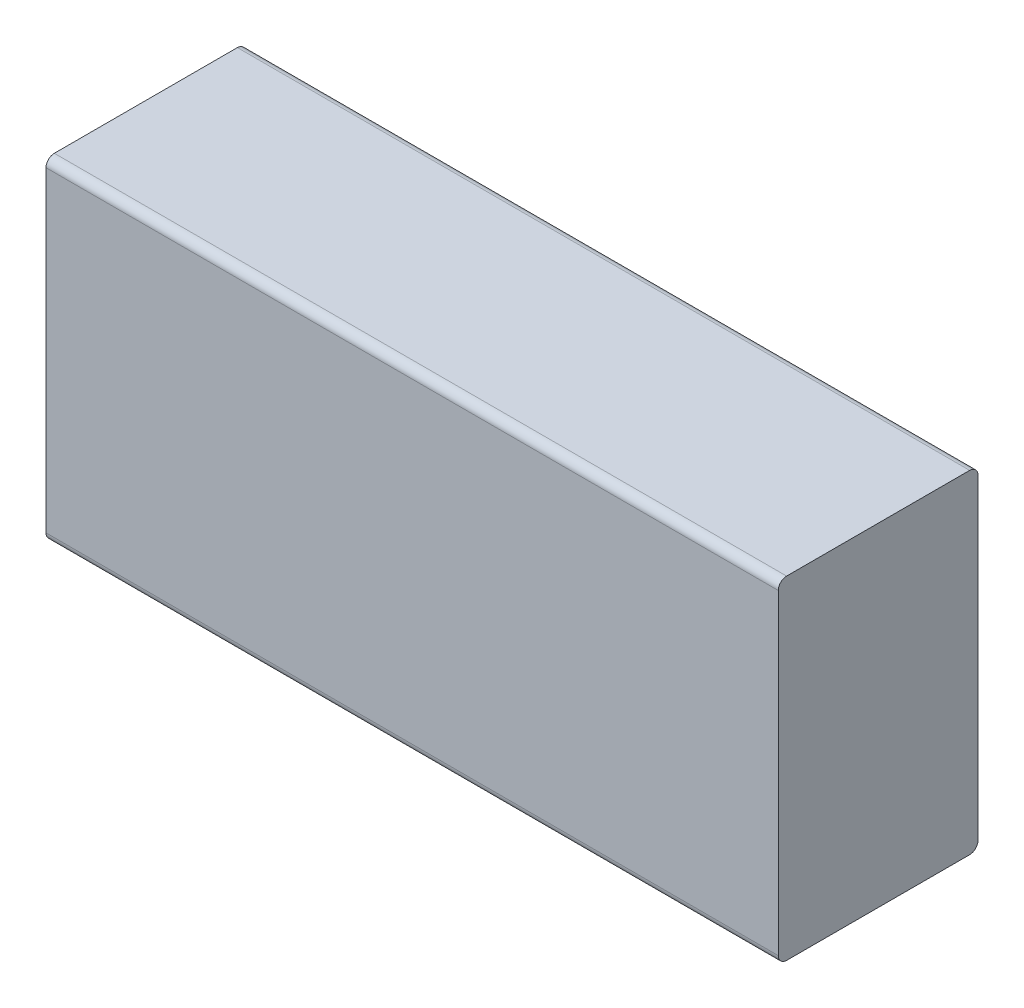
ISO-10303-21;
HEADER;
FILE_DESCRIPTION(('STEP AP214'),'2;1');
FILE_NAME('part.step','',(''),(''),'','','');
FILE_SCHEMA(('AUTOMOTIVE_DESIGN { 1 0 10303 214 1 1 1 1 }'));
ENDSEC;
DATA;
#1=APPLICATION_CONTEXT('core data for automotive mechanical design processes');
#2=APPLICATION_PROTOCOL_DEFINITION('international standard','automotive_design',2000,#1);
#3=PRODUCT_CONTEXT('',#1,'mechanical');
#4=PRODUCT('Part','Part','',(#3));
#5=PRODUCT_RELATED_PRODUCT_CATEGORY('part','',(#4));
#6=PRODUCT_DEFINITION_FORMATION('','',#4);
#7=PRODUCT_DEFINITION_CONTEXT('part definition',#1,'design');
#8=PRODUCT_DEFINITION('design','',#6,#7);
#9=PRODUCT_DEFINITION_SHAPE('','',#8);
#10=(LENGTH_UNIT() NAMED_UNIT(*) SI_UNIT(.MILLI.,.METRE.));
#11=(NAMED_UNIT(*) PLANE_ANGLE_UNIT() SI_UNIT($,.RADIAN.));
#12=(NAMED_UNIT(*) SI_UNIT($,.STERADIAN.) SOLID_ANGLE_UNIT());
#13=UNCERTAINTY_MEASURE_WITH_UNIT(LENGTH_MEASURE(1.E-05),#10,'distance_accuracy_value','');
#14=(GEOMETRIC_REPRESENTATION_CONTEXT(3) GLOBAL_UNCERTAINTY_ASSIGNED_CONTEXT((#13)) GLOBAL_UNIT_ASSIGNED_CONTEXT((#10,
#11,#12)) REPRESENTATION_CONTEXT('',''));
#15=CARTESIAN_POINT('',(0.,0.,0.));
#16=DIRECTION('',(0.,0.,1.));
#17=DIRECTION('',(1.,0.,0.));
#18=AXIS2_PLACEMENT_3D('',#15,#16,#17);
#19=CARTESIAN_POINT('',(0.,5.,6.));
#20=DIRECTION('',(0.,-1.,0.));
#21=DIRECTION('',(1.,0.,0.));
#22=AXIS2_PLACEMENT_3D('',#19,#20,#21);
#23=PLANE('',#22);
#24=DIRECTION('',(0.,0.,-1.));
#25=VECTOR('',#24,1.);
#26=CARTESIAN_POINT('',(5.,5.,6.));
#27=LINE('',#26,#25);
#28=CARTESIAN_POINT('',(5.,5.,5.75));
#29=VERTEX_POINT('',#28);
#30=CARTESIAN_POINT('',(5.,5.,0.25));
#31=VERTEX_POINT('',#30);
#32=EDGE_CURVE('E121',#29,#31,#27,.T.);
#33=ORIENTED_EDGE('',*,*,#32,.T.);
#34=DIRECTION('',(-1.,0.,0.));
#35=VECTOR('',#34,1.);
#36=CARTESIAN_POINT('',(-17.,5.,0.25));
#37=LINE('',#36,#35);
#38=CARTESIAN_POINT('',(-17.,5.,0.25));
#39=VERTEX_POINT('',#38);
#40=EDGE_CURVE('E11',#31,#39,#37,.T.);
#41=ORIENTED_EDGE('',*,*,#40,.T.);
#42=DIRECTION('',(0.,0.,-1.));
#43=VECTOR('',#42,1.);
#44=CARTESIAN_POINT('',(-17.,5.,6.));
#45=LINE('',#44,#43);
#46=CARTESIAN_POINT('',(-17.,5.,5.75));
#47=VERTEX_POINT('',#46);
#48=EDGE_CURVE('E126',#47,#39,#45,.T.);
#49=ORIENTED_EDGE('',*,*,#48,.F.);
#50=DIRECTION('',(-1.,0.,0.));
#51=VECTOR('',#50,1.);
#52=CARTESIAN_POINT('',(0.,5.,5.75));
#53=LINE('',#52,#51);
#54=EDGE_CURVE('E41',#47,#29,#53,.F.);
#55=ORIENTED_EDGE('',*,*,#54,.T.);
#56=EDGE_LOOP('',(#33,#41,#49,#55));
#57=FACE_BOUND('',#56,.T.);
#58=ADVANCED_FACE('F33',(#57),#23,.F.);
#59=CARTESIAN_POINT('',(-17.,5.,6.));
#60=DIRECTION('',(1.,0.,0.));
#61=DIRECTION('',(0.,0.,-1.));
#62=AXIS2_PLACEMENT_3D('',#59,#60,#61);
#63=PLANE('',#62);
#64=DIRECTION('',(0.,-1.,0.));
#65=VECTOR('',#64,1.);
#66=CARTESIAN_POINT('',(-17.,5.,0.));
#67=LINE('',#66,#65);
#68=CARTESIAN_POINT('',(-17.,4.75,0.));
#69=VERTEX_POINT('',#68);
#70=CARTESIAN_POINT('',(-17.,-4.75,0.));
#71=VERTEX_POINT('',#70);
#72=EDGE_CURVE('E120',#69,#71,#67,.T.);
#73=ORIENTED_EDGE('',*,*,#72,.T.);
#74=CARTESIAN_POINT('',(-17.,-4.75,0.25));
#75=DIRECTION('',(1.,0.,0.));
#76=DIRECTION('',(0.,0.,-1.));
#77=AXIS2_PLACEMENT_3D('',#74,#75,#76);
#78=CIRCLE('',#77,0.25);
#79=CARTESIAN_POINT('',(-17.,-5.,0.25));
#80=VERTEX_POINT('',#79);
#81=EDGE_CURVE('E144',#71,#80,#78,.F.);
#82=ORIENTED_EDGE('',*,*,#81,.T.);
#83=DIRECTION('',(0.,0.,-1.));
#84=VECTOR('',#83,1.);
#85=CARTESIAN_POINT('',(-17.,-5.,6.));
#86=LINE('',#85,#84);
#87=CARTESIAN_POINT('',(-17.,-5.,5.75));
#88=VERTEX_POINT('',#87);
#89=EDGE_CURVE('E130',#88,#80,#86,.T.);
#90=ORIENTED_EDGE('',*,*,#89,.F.);
#91=CARTESIAN_POINT('',(-17.,-4.75,5.75));
#92=DIRECTION('',(1.,0.,0.));
#93=DIRECTION('',(0.,0.,-1.));
#94=AXIS2_PLACEMENT_3D('',#91,#92,#93);
#95=CIRCLE('',#94,0.25);
#96=CARTESIAN_POINT('',(-17.,-4.75,6.));
#97=VERTEX_POINT('',#96);
#98=EDGE_CURVE('E125',#88,#97,#95,.F.);
#99=ORIENTED_EDGE('',*,*,#98,.T.);
#100=DIRECTION('',(0.,-1.,0.));
#101=VECTOR('',#100,1.);
#102=CARTESIAN_POINT('',(-17.,5.,6.));
#103=LINE('',#102,#101);
#104=CARTESIAN_POINT('',(-17.,4.75,6.));
#105=VERTEX_POINT('',#104);
#106=EDGE_CURVE('E163',#105,#97,#103,.T.);
#107=ORIENTED_EDGE('',*,*,#106,.F.);
#108=CARTESIAN_POINT('',(-17.,4.75,5.75));
#109=DIRECTION('',(1.,0.,0.));
#110=DIRECTION('',(0.,0.,-1.));
#111=AXIS2_PLACEMENT_3D('',#108,#109,#110);
#112=CIRCLE('',#111,0.25);
#113=EDGE_CURVE('E55',#105,#47,#112,.F.);
#114=ORIENTED_EDGE('',*,*,#113,.T.);
#115=ORIENTED_EDGE('',*,*,#48,.T.);
#116=CARTESIAN_POINT('',(-17.,4.75,0.25));
#117=DIRECTION('',(1.,0.,0.));
#118=DIRECTION('',(0.,0.,-1.));
#119=AXIS2_PLACEMENT_3D('',#116,#117,#118);
#120=CIRCLE('',#119,0.25);
#121=EDGE_CURVE('E48',#39,#69,#120,.F.);
#122=ORIENTED_EDGE('',*,*,#121,.T.);
#123=EDGE_LOOP('',(#73,#82,#90,#99,#107,#114,#115,#122));
#124=FACE_BOUND('',#123,.T.);
#125=ADVANCED_FACE('F165',(#124),#63,.F.);
#126=CARTESIAN_POINT('',(-17.,-5.,6.));
#127=DIRECTION('',(0.,1.,0.));
#128=DIRECTION('',(-1.,0.,0.));
#129=AXIS2_PLACEMENT_3D('',#126,#127,#128);
#130=PLANE('',#129);
#131=ORIENTED_EDGE('',*,*,#89,.T.);
#132=DIRECTION('',(1.,0.,0.));
#133=VECTOR('',#132,1.);
#134=CARTESIAN_POINT('',(5.,-5.,0.25));
#135=LINE('',#134,#133);
#136=CARTESIAN_POINT('',(5.,-5.,0.25));
#137=VERTEX_POINT('',#136);
#138=EDGE_CURVE('E119',#80,#137,#135,.T.);
#139=ORIENTED_EDGE('',*,*,#138,.T.);
#140=DIRECTION('',(0.,0.,-1.));
#141=VECTOR('',#140,1.);
#142=CARTESIAN_POINT('',(5.,-5.,6.));
#143=LINE('',#142,#141);
#144=CARTESIAN_POINT('',(5.,-5.,5.75));
#145=VERTEX_POINT('',#144);
#146=EDGE_CURVE('E102',#145,#137,#143,.T.);
#147=ORIENTED_EDGE('',*,*,#146,.F.);
#148=DIRECTION('',(1.,0.,0.));
#149=VECTOR('',#148,1.);
#150=CARTESIAN_POINT('',(-17.,-5.,5.75));
#151=LINE('',#150,#149);
#152=EDGE_CURVE('E116',#145,#88,#151,.F.);
#153=ORIENTED_EDGE('',*,*,#152,.T.);
#154=EDGE_LOOP('',(#131,#139,#147,#153));
#155=FACE_BOUND('',#154,.T.);
#156=ADVANCED_FACE('F115',(#155),#130,.F.);
#157=CARTESIAN_POINT('',(0.,0.,6.));
#158=DIRECTION('',(0.,0.,-1.));
#159=DIRECTION('',(-1.,0.,0.));
#160=AXIS2_PLACEMENT_3D('',#157,#158,#159);
#161=PLANE('',#160);
#162=ORIENTED_EDGE('',*,*,#106,.T.);
#163=DIRECTION('',(1.,0.,0.));
#164=VECTOR('',#163,1.);
#165=CARTESIAN_POINT('',(0.,-4.75,6.));
#166=LINE('',#165,#164);
#167=CARTESIAN_POINT('',(5.,-4.75,6.));
#168=VERTEX_POINT('',#167);
#169=EDGE_CURVE('E149',#97,#168,#166,.T.);
#170=ORIENTED_EDGE('',*,*,#169,.T.);
#171=DIRECTION('',(0.,1.,0.));
#172=VECTOR('',#171,1.);
#173=CARTESIAN_POINT('',(5.,5.,6.));
#174=LINE('',#173,#172);
#175=CARTESIAN_POINT('',(5.,4.75,6.));
#176=VERTEX_POINT('',#175);
#177=EDGE_CURVE('E104',#168,#176,#174,.T.);
#178=ORIENTED_EDGE('',*,*,#177,.T.);
#179=DIRECTION('',(-1.,0.,0.));
#180=VECTOR('',#179,1.);
#181=CARTESIAN_POINT('',(0.,4.75,6.));
#182=LINE('',#181,#180);
#183=EDGE_CURVE('E146',#176,#105,#182,.T.);
#184=ORIENTED_EDGE('',*,*,#183,.T.);
#185=EDGE_LOOP('',(#162,#170,#178,#184));
#186=FACE_BOUND('',#185,.T.);
#187=ADVANCED_FACE('F162',(#186),#161,.F.);
#188=CARTESIAN_POINT('',(0.,0.,0.));
#189=DIRECTION('',(0.,0.,-1.));
#190=DIRECTION('',(-1.,0.,0.));
#191=AXIS2_PLACEMENT_3D('',#188,#189,#190);
#192=PLANE('',#191);
#193=DIRECTION('',(0.,1.,0.));
#194=VECTOR('',#193,1.);
#195=CARTESIAN_POINT('',(5.,5.,0.));
#196=LINE('',#195,#194);
#197=CARTESIAN_POINT('',(5.,-4.75,0.));
#198=VERTEX_POINT('',#197);
#199=CARTESIAN_POINT('',(5.,4.75,0.));
#200=VERTEX_POINT('',#199);
#201=EDGE_CURVE('E169',#198,#200,#196,.T.);
#202=ORIENTED_EDGE('',*,*,#201,.F.);
#203=DIRECTION('',(1.,0.,0.));
#204=VECTOR('',#203,1.);
#205=CARTESIAN_POINT('',(-17.,-4.75,0.));
#206=LINE('',#205,#204);
#207=EDGE_CURVE('E139',#198,#71,#206,.F.);
#208=ORIENTED_EDGE('',*,*,#207,.T.);
#209=ORIENTED_EDGE('',*,*,#72,.F.);
#210=DIRECTION('',(-1.,0.,0.));
#211=VECTOR('',#210,1.);
#212=CARTESIAN_POINT('',(5.,4.75,0.));
#213=LINE('',#212,#211);
#214=EDGE_CURVE('E137',#69,#200,#213,.F.);
#215=ORIENTED_EDGE('',*,*,#214,.T.);
#216=EDGE_LOOP('',(#202,#208,#209,#215));
#217=FACE_BOUND('',#216,.T.);
#218=ADVANCED_FACE('F177',(#217),#192,.T.);
#219=CARTESIAN_POINT('',(5.,5.,6.));
#220=DIRECTION('',(-1.,0.,0.));
#221=DIRECTION('',(0.,0.,1.));
#222=AXIS2_PLACEMENT_3D('',#219,#220,#221);
#223=PLANE('',#222);
#224=ORIENTED_EDGE('',*,*,#146,.T.);
#225=CARTESIAN_POINT('',(5.,-4.75,0.25));
#226=DIRECTION('',(-1.,0.,0.));
#227=DIRECTION('',(0.,0.,1.));
#228=AXIS2_PLACEMENT_3D('',#225,#226,#227);
#229=CIRCLE('',#228,0.25);
#230=EDGE_CURVE('E109',#137,#198,#229,.F.);
#231=ORIENTED_EDGE('',*,*,#230,.T.);
#232=ORIENTED_EDGE('',*,*,#201,.T.);
#233=CARTESIAN_POINT('',(5.,4.75,0.25));
#234=DIRECTION('',(-1.,0.,0.));
#235=DIRECTION('',(0.,0.,1.));
#236=AXIS2_PLACEMENT_3D('',#233,#234,#235);
#237=CIRCLE('',#236,0.25);
#238=EDGE_CURVE('E110',#200,#31,#237,.F.);
#239=ORIENTED_EDGE('',*,*,#238,.T.);
#240=ORIENTED_EDGE('',*,*,#32,.F.);
#241=CARTESIAN_POINT('',(5.,4.75,5.75));
#242=DIRECTION('',(-1.,0.,0.));
#243=DIRECTION('',(0.,0.,1.));
#244=AXIS2_PLACEMENT_3D('',#241,#242,#243);
#245=CIRCLE('',#244,0.25);
#246=EDGE_CURVE('E128',#29,#176,#245,.F.);
#247=ORIENTED_EDGE('',*,*,#246,.T.);
#248=ORIENTED_EDGE('',*,*,#177,.F.);
#249=CARTESIAN_POINT('',(5.,-4.75,5.75));
#250=DIRECTION('',(-1.,0.,0.));
#251=DIRECTION('',(0.,0.,1.));
#252=AXIS2_PLACEMENT_3D('',#249,#250,#251);
#253=CIRCLE('',#252,0.25);
#254=EDGE_CURVE('E99',#168,#145,#253,.F.);
#255=ORIENTED_EDGE('',*,*,#254,.T.);
#256=EDGE_LOOP('',(#224,#231,#232,#239,#240,#247,#248,#255));
#257=FACE_BOUND('',#256,.T.);
#258=ADVANCED_FACE('F101',(#257),#223,.F.);
#259=CARTESIAN_POINT('',(-17.,-4.75,0.25));
#260=DIRECTION('',(-1.,0.,0.));
#261=DIRECTION('',(0.,-1.,0.));
#262=AXIS2_PLACEMENT_3D('',#259,#260,#261);
#263=CYLINDRICAL_SURFACE('',#262,0.25);
#264=ORIENTED_EDGE('',*,*,#81,.F.);
#265=ORIENTED_EDGE('',*,*,#207,.F.);
#266=ORIENTED_EDGE('',*,*,#230,.F.);
#267=ORIENTED_EDGE('',*,*,#138,.F.);
#268=EDGE_LOOP('',(#264,#265,#266,#267));
#269=FACE_BOUND('',#268,.T.);
#270=ADVANCED_FACE('F179',(#269),#263,.T.);
#271=CARTESIAN_POINT('',(0.,-4.75,5.75));
#272=DIRECTION('',(1.,0.,0.));
#273=DIRECTION('',(0.,1.,0.));
#274=AXIS2_PLACEMENT_3D('',#271,#272,#273);
#275=CYLINDRICAL_SURFACE('',#274,0.25);
#276=ORIENTED_EDGE('',*,*,#98,.F.);
#277=ORIENTED_EDGE('',*,*,#152,.F.);
#278=ORIENTED_EDGE('',*,*,#254,.F.);
#279=ORIENTED_EDGE('',*,*,#169,.F.);
#280=EDGE_LOOP('',(#276,#277,#278,#279));
#281=FACE_BOUND('',#280,.T.);
#282=ADVANCED_FACE('F124',(#281),#275,.T.);
#283=CARTESIAN_POINT('',(0.,4.75,0.25));
#284=DIRECTION('',(1.,0.,0.));
#285=DIRECTION('',(0.,1.,0.));
#286=AXIS2_PLACEMENT_3D('',#283,#284,#285);
#287=CYLINDRICAL_SURFACE('',#286,0.25);
#288=ORIENTED_EDGE('',*,*,#238,.F.);
#289=ORIENTED_EDGE('',*,*,#214,.F.);
#290=ORIENTED_EDGE('',*,*,#121,.F.);
#291=ORIENTED_EDGE('',*,*,#40,.F.);
#292=EDGE_LOOP('',(#288,#289,#290,#291));
#293=FACE_BOUND('',#292,.T.);
#294=ADVANCED_FACE('F174',(#293),#287,.T.);
#295=CARTESIAN_POINT('',(0.,4.75,5.75));
#296=DIRECTION('',(-1.,0.,0.));
#297=DIRECTION('',(0.,-1.,0.));
#298=AXIS2_PLACEMENT_3D('',#295,#296,#297);
#299=CYLINDRICAL_SURFACE('',#298,0.25);
#300=ORIENTED_EDGE('',*,*,#246,.F.);
#301=ORIENTED_EDGE('',*,*,#54,.F.);
#302=ORIENTED_EDGE('',*,*,#113,.F.);
#303=ORIENTED_EDGE('',*,*,#183,.F.);
#304=EDGE_LOOP('',(#300,#301,#302,#303));
#305=FACE_BOUND('',#304,.T.);
#306=ADVANCED_FACE('F35',(#305),#299,.T.);
#307=CLOSED_SHELL('',(#58,#125,#156,#187,#218,#258,#270,#282,#294,#306));
#308=MANIFOLD_SOLID_BREP('B2',#307);
#309=ADVANCED_BREP_SHAPE_REPRESENTATION('',(#18,#308),#14);
#310=SHAPE_DEFINITION_REPRESENTATION(#9,#309);
ENDSEC;
END-ISO-10303-21;
